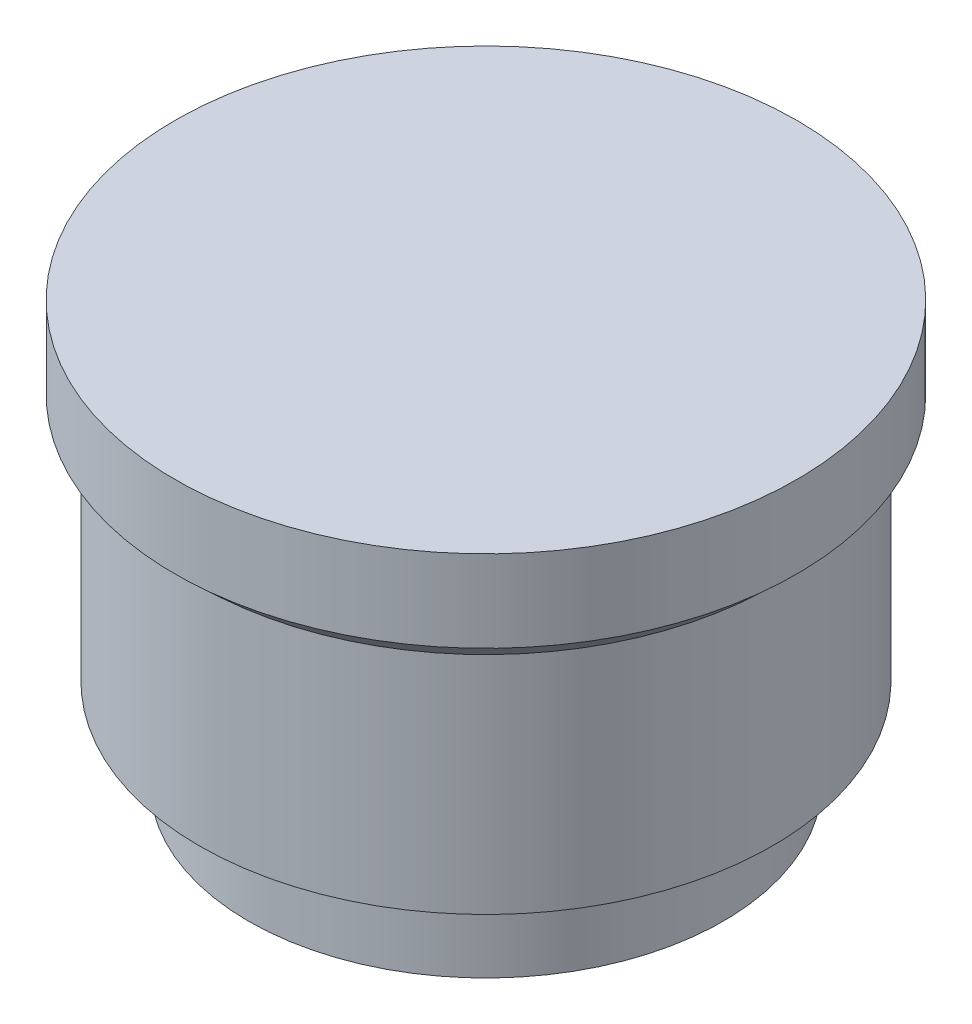
ISO-10303-21;
HEADER;
FILE_DESCRIPTION(('STEP AP214'),'2;1');
FILE_NAME('part.step','',(''),(''),'','','');
FILE_SCHEMA(('AUTOMOTIVE_DESIGN { 1 0 10303 214 1 1 1 1 }'));
ENDSEC;
DATA;
#1=APPLICATION_CONTEXT('core data for automotive mechanical design processes');
#2=APPLICATION_PROTOCOL_DEFINITION('international standard','automotive_design',2000,#1);
#3=PRODUCT_CONTEXT('',#1,'mechanical');
#4=PRODUCT('Part','Part','',(#3));
#5=PRODUCT_RELATED_PRODUCT_CATEGORY('part','',(#4));
#6=PRODUCT_DEFINITION_FORMATION('','',#4);
#7=PRODUCT_DEFINITION_CONTEXT('part definition',#1,'design');
#8=PRODUCT_DEFINITION('design','',#6,#7);
#9=PRODUCT_DEFINITION_SHAPE('','',#8);
#10=(LENGTH_UNIT() NAMED_UNIT(*) SI_UNIT(.MILLI.,.METRE.));
#11=(NAMED_UNIT(*) PLANE_ANGLE_UNIT() SI_UNIT($,.RADIAN.));
#12=(NAMED_UNIT(*) SI_UNIT($,.STERADIAN.) SOLID_ANGLE_UNIT());
#13=UNCERTAINTY_MEASURE_WITH_UNIT(LENGTH_MEASURE(1.E-05),#10,'distance_accuracy_value','');
#14=(GEOMETRIC_REPRESENTATION_CONTEXT(3) GLOBAL_UNCERTAINTY_ASSIGNED_CONTEXT((#13)) GLOBAL_UNIT_ASSIGNED_CONTEXT((#10,
#11,#12)) REPRESENTATION_CONTEXT('',''));
#15=CARTESIAN_POINT('',(0.,0.,0.));
#16=DIRECTION('',(0.,0.,1.));
#17=DIRECTION('',(1.,0.,0.));
#18=AXIS2_PLACEMENT_3D('',#15,#16,#17);
#19=CARTESIAN_POINT('',(0.,-13.5651355044389,0.));
#20=DIRECTION('',(0.,-1.,0.));
#21=DIRECTION('',(0.,0.,-1.));
#22=AXIS2_PLACEMENT_3D('',#19,#20,#21);
#23=CYLINDRICAL_SURFACE('',#22,29.);
#24=CARTESIAN_POINT('',(0.,0.,0.));
#25=DIRECTION('',(0.,-1.,0.));
#26=DIRECTION('',(0.,0.,-1.));
#27=AXIS2_PLACEMENT_3D('',#24,#25,#26);
#28=CIRCLE('',#27,29.);
#29=CARTESIAN_POINT('',(0.,0.,-29.));
#30=VERTEX_POINT('',#29);
#31=EDGE_CURVE('E10',#30,#30,#28,.T.);
#32=ORIENTED_EDGE('',*,*,#31,.F.);
#33=EDGE_LOOP('',(#32));
#34=FACE_BOUND('',#33,.T.);
#35=CARTESIAN_POINT('',(0.,7.5,0.));
#36=DIRECTION('',(0.,-1.,0.));
#37=DIRECTION('',(0.,0.,-1.));
#38=AXIS2_PLACEMENT_3D('',#35,#36,#37);
#39=CIRCLE('',#38,29.);
#40=CARTESIAN_POINT('',(0.,7.5,-29.));
#41=VERTEX_POINT('',#40);
#42=EDGE_CURVE('E57',#41,#41,#39,.T.);
#43=ORIENTED_EDGE('',*,*,#42,.T.);
#44=EDGE_LOOP('',(#43));
#45=FACE_BOUND('',#44,.T.);
#46=ADVANCED_FACE('F35',(#34,#45),#23,.T.);
#47=CARTESIAN_POINT('',(-29.,0.,0.));
#48=DIRECTION('',(0.,1.,0.));
#49=DIRECTION('',(0.,0.,1.));
#50=AXIS2_PLACEMENT_3D('',#47,#48,#49);
#51=PLANE('',#50);
#52=ORIENTED_EDGE('',*,*,#31,.T.);
#53=EDGE_LOOP('',(#52));
#54=FACE_BOUND('',#53,.T.);
#55=ADVANCED_FACE('F87',(#54),#51,.F.);
#56=CARTESIAN_POINT('',(0.,51.25,0.));
#57=DIRECTION('',(0.,-1.,0.));
#58=DIRECTION('',(0.,0.,-1.));
#59=AXIS2_PLACEMENT_3D('',#56,#57,#58);
#60=PLANE('',#59);
#61=CARTESIAN_POINT('',(0.,51.25,0.));
#62=DIRECTION('',(0.,-1.,0.));
#63=DIRECTION('',(0.,0.,-1.));
#64=AXIS2_PLACEMENT_3D('',#61,#62,#63);
#65=CIRCLE('',#64,38.);
#66=CARTESIAN_POINT('',(0.,51.25,-38.));
#67=VERTEX_POINT('',#66);
#68=EDGE_CURVE('E41',#67,#67,#65,.T.);
#69=ORIENTED_EDGE('',*,*,#68,.F.);
#70=EDGE_LOOP('',(#69));
#71=FACE_BOUND('',#70,.T.);
#72=ADVANCED_FACE('F82',(#71),#60,.F.);
#73=CARTESIAN_POINT('',(0.,-13.5651355044389,0.));
#74=DIRECTION('',(0.,-1.,0.));
#75=DIRECTION('',(0.,0.,-1.));
#76=AXIS2_PLACEMENT_3D('',#73,#74,#75);
#77=CYLINDRICAL_SURFACE('',#76,38.);
#78=CARTESIAN_POINT('',(0.,41.25,0.));
#79=DIRECTION('',(0.,-1.,0.));
#80=DIRECTION('',(0.,0.,-1.));
#81=AXIS2_PLACEMENT_3D('',#78,#79,#80);
#82=CIRCLE('',#81,38.);
#83=CARTESIAN_POINT('',(0.,41.25,-38.));
#84=VERTEX_POINT('',#83);
#85=EDGE_CURVE('E45',#84,#84,#82,.T.);
#86=ORIENTED_EDGE('',*,*,#85,.F.);
#87=EDGE_LOOP('',(#86));
#88=FACE_BOUND('',#87,.T.);
#89=ORIENTED_EDGE('',*,*,#68,.T.);
#90=EDGE_LOOP('',(#89));
#91=FACE_BOUND('',#90,.T.);
#92=ADVANCED_FACE('F77',(#88,#91),#77,.T.);
#93=CARTESIAN_POINT('',(0.,41.25,0.));
#94=DIRECTION('',(0.,1.,0.));
#95=DIRECTION('',(0.,0.,1.));
#96=AXIS2_PLACEMENT_3D('',#93,#94,#95);
#97=CONICAL_SURFACE('',#96,38.,0.822385327372842);
#98=CARTESIAN_POINT('',(0.,38.4641016151378,0.));
#99=DIRECTION('',(0.,-1.,0.));
#100=DIRECTION('',(0.,0.,-1.));
#101=AXIS2_PLACEMENT_3D('',#98,#99,#100);
#102=CIRCLE('',#101,35.);
#103=CARTESIAN_POINT('',(0.,38.4641016151378,-35.));
#104=VERTEX_POINT('',#103);
#105=EDGE_CURVE('E49',#104,#104,#102,.T.);
#106=ORIENTED_EDGE('',*,*,#105,.F.);
#107=EDGE_LOOP('',(#106));
#108=FACE_BOUND('',#107,.T.);
#109=ORIENTED_EDGE('',*,*,#85,.T.);
#110=EDGE_LOOP('',(#109));
#111=FACE_BOUND('',#110,.T.);
#112=ADVANCED_FACE('F71',(#108,#111),#97,.T.);
#113=CARTESIAN_POINT('',(0.,-13.5651355044389,0.));
#114=DIRECTION('',(0.,-1.,0.));
#115=DIRECTION('',(0.,0.,-1.));
#116=AXIS2_PLACEMENT_3D('',#113,#114,#115);
#117=CYLINDRICAL_SURFACE('',#116,35.);
#118=CARTESIAN_POINT('',(0.,10.9641016151378,0.));
#119=DIRECTION('',(0.,-1.,0.));
#120=DIRECTION('',(0.,0.,-1.));
#121=AXIS2_PLACEMENT_3D('',#118,#119,#120);
#122=CIRCLE('',#121,35.);
#123=CARTESIAN_POINT('',(0.,10.9641016151378,-35.));
#124=VERTEX_POINT('',#123);
#125=EDGE_CURVE('E54',#124,#124,#122,.T.);
#126=ORIENTED_EDGE('',*,*,#125,.F.);
#127=EDGE_LOOP('',(#126));
#128=FACE_BOUND('',#127,.T.);
#129=ORIENTED_EDGE('',*,*,#105,.T.);
#130=EDGE_LOOP('',(#129));
#131=FACE_BOUND('',#130,.T.);
#132=ADVANCED_FACE('F65',(#128,#131),#117,.T.);
#133=CARTESIAN_POINT('',(0.,10.9641016151378,0.));
#134=DIRECTION('',(0.,1.,0.));
#135=DIRECTION('',(0.,0.,1.));
#136=AXIS2_PLACEMENT_3D('',#133,#134,#135);
#137=CONICAL_SURFACE('',#136,35.,1.0471975511966);
#138=ORIENTED_EDGE('',*,*,#42,.F.);
#139=EDGE_LOOP('',(#138));
#140=FACE_BOUND('',#139,.T.);
#141=ORIENTED_EDGE('',*,*,#125,.T.);
#142=EDGE_LOOP('',(#141));
#143=FACE_BOUND('',#142,.T.);
#144=ADVANCED_FACE('F62',(#140,#143),#137,.T.);
#145=CLOSED_SHELL('',(#46,#55,#72,#92,#112,#132,#144));
#146=MANIFOLD_SOLID_BREP('B2',#145);
#147=ADVANCED_BREP_SHAPE_REPRESENTATION('',(#18,#146),#14);
#148=SHAPE_DEFINITION_REPRESENTATION(#9,#147);
ENDSEC;
END-ISO-10303-21;
